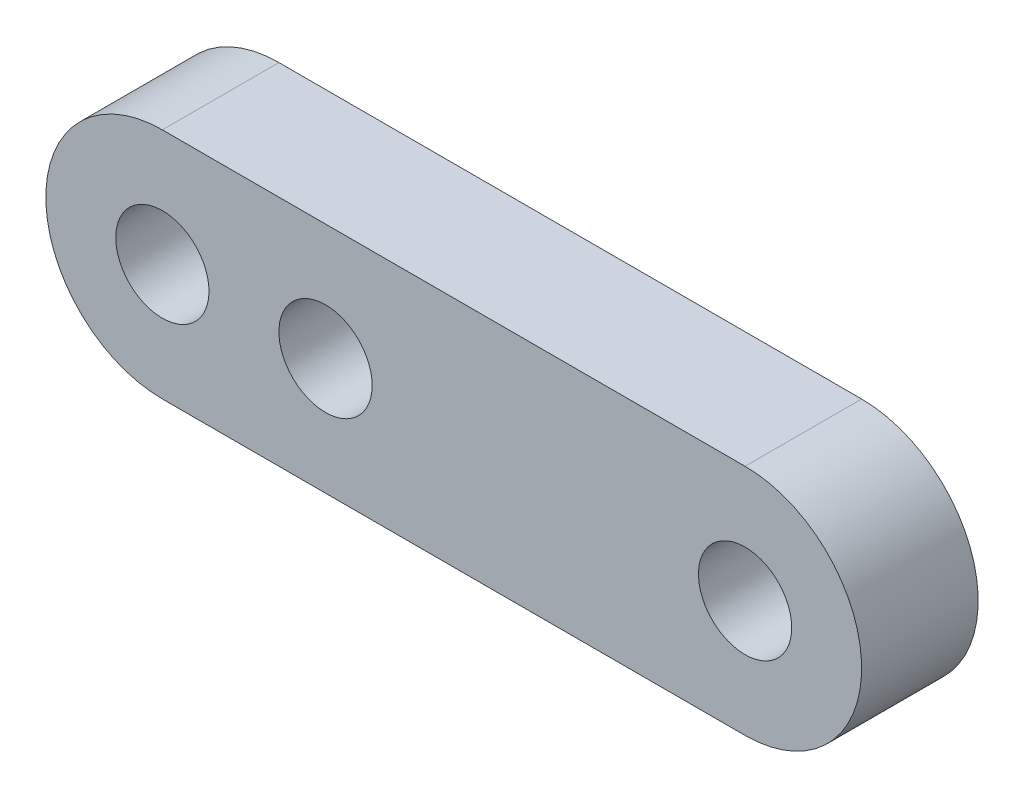
ISO-10303-21;
HEADER;
FILE_DESCRIPTION(('STEP AP214'),'2;1');
FILE_NAME('part.step','',(''),(''),'','','');
FILE_SCHEMA(('AUTOMOTIVE_DESIGN { 1 0 10303 214 1 1 1 1 }'));
ENDSEC;
DATA;
#1=APPLICATION_CONTEXT('core data for automotive mechanical design processes');
#2=APPLICATION_PROTOCOL_DEFINITION('international standard','automotive_design',2000,#1);
#3=PRODUCT_CONTEXT('',#1,'mechanical');
#4=PRODUCT('Part','Part','',(#3));
#5=PRODUCT_RELATED_PRODUCT_CATEGORY('part','',(#4));
#6=PRODUCT_DEFINITION_FORMATION('','',#4);
#7=PRODUCT_DEFINITION_CONTEXT('part definition',#1,'design');
#8=PRODUCT_DEFINITION('design','',#6,#7);
#9=PRODUCT_DEFINITION_SHAPE('','',#8);
#10=(LENGTH_UNIT() NAMED_UNIT(*) SI_UNIT(.MILLI.,.METRE.));
#11=(NAMED_UNIT(*) PLANE_ANGLE_UNIT() SI_UNIT($,.RADIAN.));
#12=(NAMED_UNIT(*) SI_UNIT($,.STERADIAN.) SOLID_ANGLE_UNIT());
#13=UNCERTAINTY_MEASURE_WITH_UNIT(LENGTH_MEASURE(1.E-05),#10,'distance_accuracy_value','');
#14=(GEOMETRIC_REPRESENTATION_CONTEXT(3) GLOBAL_UNCERTAINTY_ASSIGNED_CONTEXT((#13)) GLOBAL_UNIT_ASSIGNED_CONTEXT((#10,
#11,#12)) REPRESENTATION_CONTEXT('',''));
#15=CARTESIAN_POINT('',(0.,0.,0.));
#16=DIRECTION('',(0.,0.,1.));
#17=DIRECTION('',(1.,0.,0.));
#18=AXIS2_PLACEMENT_3D('',#15,#16,#17);
#19=CARTESIAN_POINT('',(10.,0.,5.));
#20=DIRECTION('',(0.,0.,1.));
#21=DIRECTION('',(1.,0.,0.));
#22=AXIS2_PLACEMENT_3D('',#19,#20,#21);
#23=PLANE('',#22);
#24=CARTESIAN_POINT('',(-8.,0.,5.));
#25=DIRECTION('',(0.,0.,1.));
#26=DIRECTION('',(1.,0.,0.));
#27=AXIS2_PLACEMENT_3D('',#24,#25,#26);
#28=CIRCLE('',#27,2.);
#29=CARTESIAN_POINT('',(-6.,0.,5.));
#30=VERTEX_POINT('',#29);
#31=EDGE_CURVE('E134',#30,#30,#28,.T.);
#32=ORIENTED_EDGE('',*,*,#31,.F.);
#33=EDGE_LOOP('',(#32));
#34=FACE_BOUND('',#33,.T.);
#35=CARTESIAN_POINT('',(10.,0.,5.));
#36=DIRECTION('',(0.,0.,1.));
#37=DIRECTION('',(1.,0.,0.));
#38=AXIS2_PLACEMENT_3D('',#35,#36,#37);
#39=CIRCLE('',#38,5.);
#40=CARTESIAN_POINT('',(10.,-5.,5.));
#41=VERTEX_POINT('',#40);
#42=CARTESIAN_POINT('',(10.,5.,5.));
#43=VERTEX_POINT('',#42);
#44=EDGE_CURVE('E92',#41,#43,#39,.T.);
#45=ORIENTED_EDGE('',*,*,#44,.T.);
#46=DIRECTION('',(-1.,0.,0.));
#47=VECTOR('',#46,1.);
#48=CARTESIAN_POINT('',(-15.,5.,5.));
#49=LINE('',#48,#47);
#50=CARTESIAN_POINT('',(-15.,5.,5.));
#51=VERTEX_POINT('',#50);
#52=EDGE_CURVE('E87',#43,#51,#49,.T.);
#53=ORIENTED_EDGE('',*,*,#52,.T.);
#54=CARTESIAN_POINT('',(-15.,0.,5.));
#55=DIRECTION('',(0.,0.,1.));
#56=DIRECTION('',(1.,0.,0.));
#57=AXIS2_PLACEMENT_3D('',#54,#55,#56);
#58=CIRCLE('',#57,5.);
#59=CARTESIAN_POINT('',(-15.,-5.,5.));
#60=VERTEX_POINT('',#59);
#61=EDGE_CURVE('E90',#51,#60,#58,.T.);
#62=ORIENTED_EDGE('',*,*,#61,.T.);
#63=DIRECTION('',(1.,0.,0.));
#64=VECTOR('',#63,1.);
#65=CARTESIAN_POINT('',(-15.,-5.,5.));
#66=LINE('',#65,#64);
#67=EDGE_CURVE('E57',#60,#41,#66,.T.);
#68=ORIENTED_EDGE('',*,*,#67,.T.);
#69=EDGE_LOOP('',(#45,#53,#62,#68));
#70=FACE_BOUND('',#69,.T.);
#71=CARTESIAN_POINT('',(-15.,0.,5.));
#72=DIRECTION('',(0.,0.,1.));
#73=DIRECTION('',(1.,0.,0.));
#74=AXIS2_PLACEMENT_3D('',#71,#72,#73);
#75=CIRCLE('',#74,2.);
#76=CARTESIAN_POINT('',(-13.,0.,5.));
#77=VERTEX_POINT('',#76);
#78=EDGE_CURVE('E112',#77,#77,#75,.T.);
#79=ORIENTED_EDGE('',*,*,#78,.F.);
#80=EDGE_LOOP('',(#79));
#81=FACE_BOUND('',#80,.T.);
#82=CARTESIAN_POINT('',(10.,0.,5.));
#83=DIRECTION('',(0.,0.,1.));
#84=DIRECTION('',(1.,0.,0.));
#85=AXIS2_PLACEMENT_3D('',#82,#83,#84);
#86=CIRCLE('',#85,2.);
#87=CARTESIAN_POINT('',(12.,0.,5.));
#88=VERTEX_POINT('',#87);
#89=EDGE_CURVE('E142',#88,#88,#86,.T.);
#90=ORIENTED_EDGE('',*,*,#89,.F.);
#91=EDGE_LOOP('',(#90));
#92=FACE_BOUND('',#91,.T.);
#93=ADVANCED_FACE('F39',(#34,#70,#81,#92),#23,.T.);
#94=CARTESIAN_POINT('',(10.,0.,0.));
#95=DIRECTION('',(0.,0.,1.));
#96=DIRECTION('',(1.,0.,0.));
#97=AXIS2_PLACEMENT_3D('',#94,#95,#96);
#98=PLANE('',#97);
#99=CARTESIAN_POINT('',(10.,0.,0.));
#100=DIRECTION('',(0.,0.,1.));
#101=DIRECTION('',(1.,0.,0.));
#102=AXIS2_PLACEMENT_3D('',#99,#100,#101);
#103=CIRCLE('',#102,5.);
#104=CARTESIAN_POINT('',(10.,-5.,0.));
#105=VERTEX_POINT('',#104);
#106=CARTESIAN_POINT('',(10.,5.,0.));
#107=VERTEX_POINT('',#106);
#108=EDGE_CURVE('E108',#105,#107,#103,.T.);
#109=ORIENTED_EDGE('',*,*,#108,.F.);
#110=DIRECTION('',(1.,0.,0.));
#111=VECTOR('',#110,1.);
#112=CARTESIAN_POINT('',(-15.,-5.,0.));
#113=LINE('',#112,#111);
#114=CARTESIAN_POINT('',(-15.,-5.,0.));
#115=VERTEX_POINT('',#114);
#116=EDGE_CURVE('E80',#115,#105,#113,.T.);
#117=ORIENTED_EDGE('',*,*,#116,.F.);
#118=CARTESIAN_POINT('',(-15.,0.,0.));
#119=DIRECTION('',(0.,0.,1.));
#120=DIRECTION('',(1.,0.,0.));
#121=AXIS2_PLACEMENT_3D('',#118,#119,#120);
#122=CIRCLE('',#121,5.);
#123=CARTESIAN_POINT('',(-15.,5.,0.));
#124=VERTEX_POINT('',#123);
#125=EDGE_CURVE('E74',#124,#115,#122,.T.);
#126=ORIENTED_EDGE('',*,*,#125,.F.);
#127=DIRECTION('',(-1.,0.,0.));
#128=VECTOR('',#127,1.);
#129=CARTESIAN_POINT('',(-15.,5.,0.));
#130=LINE('',#129,#128);
#131=EDGE_CURVE('E97',#107,#124,#130,.T.);
#132=ORIENTED_EDGE('',*,*,#131,.F.);
#133=EDGE_LOOP('',(#109,#117,#126,#132));
#134=FACE_BOUND('',#133,.T.);
#135=CARTESIAN_POINT('',(-15.,0.,0.));
#136=DIRECTION('',(0.,0.,1.));
#137=DIRECTION('',(1.,0.,0.));
#138=AXIS2_PLACEMENT_3D('',#135,#136,#137);
#139=CIRCLE('',#138,2.);
#140=CARTESIAN_POINT('',(-13.,0.,0.));
#141=VERTEX_POINT('',#140);
#142=EDGE_CURVE('E130',#141,#141,#139,.T.);
#143=ORIENTED_EDGE('',*,*,#142,.T.);
#144=EDGE_LOOP('',(#143));
#145=FACE_BOUND('',#144,.T.);
#146=CARTESIAN_POINT('',(-8.,0.,0.));
#147=DIRECTION('',(0.,0.,1.));
#148=DIRECTION('',(1.,0.,0.));
#149=AXIS2_PLACEMENT_3D('',#146,#147,#148);
#150=CIRCLE('',#149,2.);
#151=CARTESIAN_POINT('',(-6.,0.,0.));
#152=VERTEX_POINT('',#151);
#153=EDGE_CURVE('E138',#152,#152,#150,.T.);
#154=ORIENTED_EDGE('',*,*,#153,.T.);
#155=EDGE_LOOP('',(#154));
#156=FACE_BOUND('',#155,.T.);
#157=CARTESIAN_POINT('',(10.,0.,0.));
#158=DIRECTION('',(0.,0.,1.));
#159=DIRECTION('',(1.,0.,0.));
#160=AXIS2_PLACEMENT_3D('',#157,#158,#159);
#161=CIRCLE('',#160,2.);
#162=CARTESIAN_POINT('',(12.,0.,0.));
#163=VERTEX_POINT('',#162);
#164=EDGE_CURVE('E146',#163,#163,#161,.T.);
#165=ORIENTED_EDGE('',*,*,#164,.T.);
#166=EDGE_LOOP('',(#165));
#167=FACE_BOUND('',#166,.T.);
#168=ADVANCED_FACE('F125',(#134,#145,#156,#167),#98,.F.);
#169=CARTESIAN_POINT('',(10.,0.,5.));
#170=DIRECTION('',(0.,0.,-1.));
#171=DIRECTION('',(-1.,0.,0.));
#172=AXIS2_PLACEMENT_3D('',#169,#170,#171);
#173=CYLINDRICAL_SURFACE('',#172,5.);
#174=ORIENTED_EDGE('',*,*,#108,.T.);
#175=DIRECTION('',(0.,0.,-1.));
#176=VECTOR('',#175,1.);
#177=CARTESIAN_POINT('',(10.,5.,5.));
#178=LINE('',#177,#176);
#179=EDGE_CURVE('E11',#43,#107,#178,.T.);
#180=ORIENTED_EDGE('',*,*,#179,.F.);
#181=ORIENTED_EDGE('',*,*,#44,.F.);
#182=DIRECTION('',(0.,0.,-1.));
#183=VECTOR('',#182,1.);
#184=CARTESIAN_POINT('',(10.,-5.,5.));
#185=LINE('',#184,#183);
#186=EDGE_CURVE('E104',#41,#105,#185,.T.);
#187=ORIENTED_EDGE('',*,*,#186,.T.);
#188=EDGE_LOOP('',(#174,#180,#181,#187));
#189=FACE_BOUND('',#188,.T.);
#190=ADVANCED_FACE('F41',(#189),#173,.T.);
#191=CARTESIAN_POINT('',(-15.,5.,5.));
#192=DIRECTION('',(0.,-1.,0.));
#193=DIRECTION('',(1.,0.,0.));
#194=AXIS2_PLACEMENT_3D('',#191,#192,#193);
#195=PLANE('',#194);
#196=ORIENTED_EDGE('',*,*,#131,.T.);
#197=DIRECTION('',(0.,0.,-1.));
#198=VECTOR('',#197,1.);
#199=CARTESIAN_POINT('',(-15.,5.,5.));
#200=LINE('',#199,#198);
#201=EDGE_CURVE('E49',#51,#124,#200,.T.);
#202=ORIENTED_EDGE('',*,*,#201,.F.);
#203=ORIENTED_EDGE('',*,*,#52,.F.);
#204=ORIENTED_EDGE('',*,*,#179,.T.);
#205=EDGE_LOOP('',(#196,#202,#203,#204));
#206=FACE_BOUND('',#205,.T.);
#207=ADVANCED_FACE('F96',(#206),#195,.F.);
#208=CARTESIAN_POINT('',(-15.,0.,5.));
#209=DIRECTION('',(0.,0.,-1.));
#210=DIRECTION('',(-1.,0.,0.));
#211=AXIS2_PLACEMENT_3D('',#208,#209,#210);
#212=CYLINDRICAL_SURFACE('',#211,5.);
#213=ORIENTED_EDGE('',*,*,#125,.T.);
#214=DIRECTION('',(0.,0.,-1.));
#215=VECTOR('',#214,1.);
#216=CARTESIAN_POINT('',(-15.,-5.,5.));
#217=LINE('',#216,#215);
#218=EDGE_CURVE('E99',#60,#115,#217,.T.);
#219=ORIENTED_EDGE('',*,*,#218,.F.);
#220=ORIENTED_EDGE('',*,*,#61,.F.);
#221=ORIENTED_EDGE('',*,*,#201,.T.);
#222=EDGE_LOOP('',(#213,#219,#220,#221));
#223=FACE_BOUND('',#222,.T.);
#224=ADVANCED_FACE('F100',(#223),#212,.T.);
#225=CARTESIAN_POINT('',(-15.,-5.,5.));
#226=DIRECTION('',(0.,1.,0.));
#227=DIRECTION('',(0.,0.,1.));
#228=AXIS2_PLACEMENT_3D('',#225,#226,#227);
#229=PLANE('',#228);
#230=ORIENTED_EDGE('',*,*,#116,.T.);
#231=ORIENTED_EDGE('',*,*,#186,.F.);
#232=ORIENTED_EDGE('',*,*,#67,.F.);
#233=ORIENTED_EDGE('',*,*,#218,.T.);
#234=EDGE_LOOP('',(#230,#231,#232,#233));
#235=FACE_BOUND('',#234,.T.);
#236=ADVANCED_FACE('F122',(#235),#229,.F.);
#237=CARTESIAN_POINT('',(-15.,0.,5.));
#238=DIRECTION('',(0.,0.,-1.));
#239=DIRECTION('',(-1.,0.,0.));
#240=AXIS2_PLACEMENT_3D('',#237,#238,#239);
#241=CYLINDRICAL_SURFACE('',#240,2.);
#242=ORIENTED_EDGE('',*,*,#78,.T.);
#243=EDGE_LOOP('',(#242));
#244=FACE_BOUND('',#243,.T.);
#245=ORIENTED_EDGE('',*,*,#142,.F.);
#246=EDGE_LOOP('',(#245));
#247=FACE_BOUND('',#246,.T.);
#248=ADVANCED_FACE('F166',(#244,#247),#241,.F.);
#249=CARTESIAN_POINT('',(-8.,0.,5.));
#250=DIRECTION('',(0.,0.,-1.));
#251=DIRECTION('',(-1.,0.,0.));
#252=AXIS2_PLACEMENT_3D('',#249,#250,#251);
#253=CYLINDRICAL_SURFACE('',#252,2.);
#254=ORIENTED_EDGE('',*,*,#31,.T.);
#255=EDGE_LOOP('',(#254));
#256=FACE_BOUND('',#255,.T.);
#257=ORIENTED_EDGE('',*,*,#153,.F.);
#258=EDGE_LOOP('',(#257));
#259=FACE_BOUND('',#258,.T.);
#260=ADVANCED_FACE('F212',(#256,#259),#253,.F.);
#261=CARTESIAN_POINT('',(10.,0.,5.));
#262=DIRECTION('',(0.,0.,-1.));
#263=DIRECTION('',(-1.,0.,0.));
#264=AXIS2_PLACEMENT_3D('',#261,#262,#263);
#265=CYLINDRICAL_SURFACE('',#264,2.);
#266=ORIENTED_EDGE('',*,*,#89,.T.);
#267=EDGE_LOOP('',(#266));
#268=FACE_BOUND('',#267,.T.);
#269=ORIENTED_EDGE('',*,*,#164,.F.);
#270=EDGE_LOOP('',(#269));
#271=FACE_BOUND('',#270,.T.);
#272=ADVANCED_FACE('F154',(#268,#271),#265,.F.);
#273=CLOSED_SHELL('',(#93,#168,#190,#207,#224,#236,#248,#260,#272));
#274=MANIFOLD_SOLID_BREP('B2',#273);
#275=ADVANCED_BREP_SHAPE_REPRESENTATION('',(#18,#274),#14);
#276=SHAPE_DEFINITION_REPRESENTATION(#9,#275);
ENDSEC;
END-ISO-10303-21;
